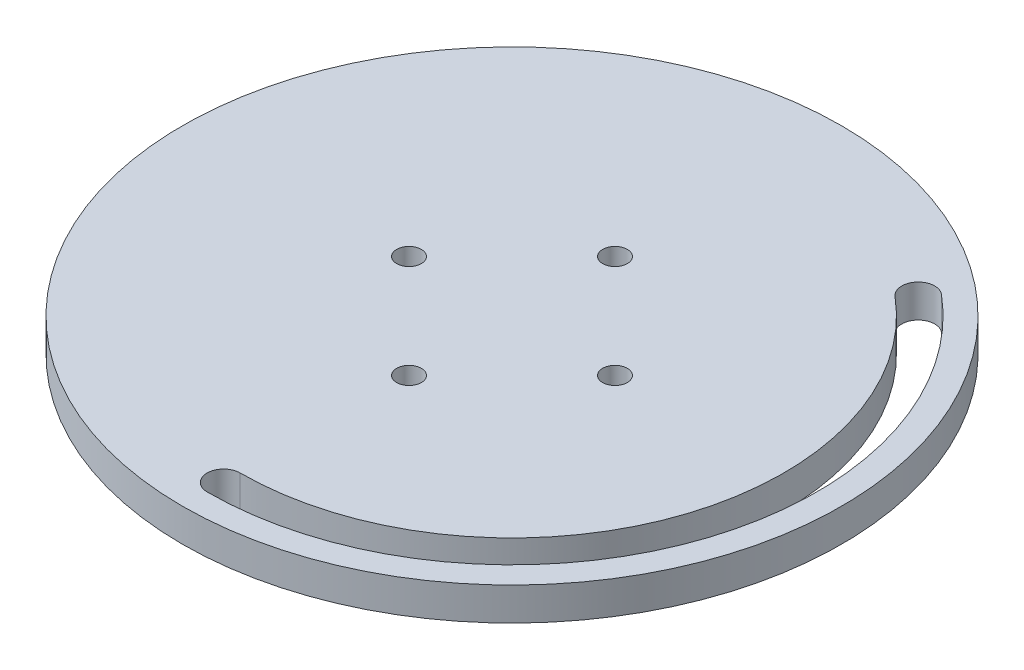
ISO-10303-21;
HEADER;
FILE_DESCRIPTION(('STEP AP214'),'2;1');
FILE_NAME('part.step','',(''),(''),'','','');
FILE_SCHEMA(('AUTOMOTIVE_DESIGN { 1 0 10303 214 1 1 1 1 }'));
ENDSEC;
DATA;
#1=APPLICATION_CONTEXT('core data for automotive mechanical design processes');
#2=APPLICATION_PROTOCOL_DEFINITION('international standard','automotive_design',2000,#1);
#3=PRODUCT_CONTEXT('',#1,'mechanical');
#4=PRODUCT('Part','Part','',(#3));
#5=PRODUCT_RELATED_PRODUCT_CATEGORY('part','',(#4));
#6=PRODUCT_DEFINITION_FORMATION('','',#4);
#7=PRODUCT_DEFINITION_CONTEXT('part definition',#1,'design');
#8=PRODUCT_DEFINITION('design','',#6,#7);
#9=PRODUCT_DEFINITION_SHAPE('','',#8);
#10=(LENGTH_UNIT() NAMED_UNIT(*) SI_UNIT(.MILLI.,.METRE.));
#11=(NAMED_UNIT(*) PLANE_ANGLE_UNIT() SI_UNIT($,.RADIAN.));
#12=(NAMED_UNIT(*) SI_UNIT($,.STERADIAN.) SOLID_ANGLE_UNIT());
#13=UNCERTAINTY_MEASURE_WITH_UNIT(LENGTH_MEASURE(1.E-05),#10,'distance_accuracy_value','');
#14=(GEOMETRIC_REPRESENTATION_CONTEXT(3) GLOBAL_UNCERTAINTY_ASSIGNED_CONTEXT((#13)) GLOBAL_UNIT_ASSIGNED_CONTEXT((#10,
#11,#12)) REPRESENTATION_CONTEXT('',''));
#15=CARTESIAN_POINT('',(0.,0.,0.));
#16=DIRECTION('',(0.,0.,1.));
#17=DIRECTION('',(1.,0.,0.));
#18=AXIS2_PLACEMENT_3D('',#15,#16,#17);
#19=CARTESIAN_POINT('',(0.,4.,0.));
#20=DIRECTION('',(0.,1.,0.));
#21=DIRECTION('',(0.,0.,1.));
#22=AXIS2_PLACEMENT_3D('',#19,#20,#21);
#23=PLANE('',#22);
#24=CARTESIAN_POINT('',(0.,4.,-12.5));
#25=DIRECTION('',(0.,1.,0.));
#26=DIRECTION('',(0.,0.,1.));
#27=AXIS2_PLACEMENT_3D('',#24,#25,#26);
#28=CIRCLE('',#27,1.5);
#29=CARTESIAN_POINT('',(0.,4.,-11.));
#30=VERTEX_POINT('',#29);
#31=EDGE_CURVE('E206',#30,#30,#28,.T.);
#32=ORIENTED_EDGE('',*,*,#31,.F.);
#33=EDGE_LOOP('',(#32));
#34=FACE_BOUND('',#33,.T.);
#35=CARTESIAN_POINT('',(0.,4.,12.5));
#36=DIRECTION('',(0.,1.,0.));
#37=DIRECTION('',(0.,0.,1.));
#38=AXIS2_PLACEMENT_3D('',#35,#36,#37);
#39=CIRCLE('',#38,1.5);
#40=CARTESIAN_POINT('',(0.,4.,14.));
#41=VERTEX_POINT('',#40);
#42=EDGE_CURVE('E102',#41,#41,#39,.T.);
#43=ORIENTED_EDGE('',*,*,#42,.F.);
#44=EDGE_LOOP('',(#43));
#45=FACE_BOUND('',#44,.T.);
#46=CARTESIAN_POINT('',(0.,4.,0.));
#47=DIRECTION('',(0.,1.,0.));
#48=DIRECTION('',(0.,0.,1.));
#49=AXIS2_PLACEMENT_3D('',#46,#47,#48);
#50=CIRCLE('',#49,40.);
#51=CARTESIAN_POINT('',(0.,4.,40.));
#52=VERTEX_POINT('',#51);
#53=EDGE_CURVE('E11',#52,#52,#50,.T.);
#54=ORIENTED_EDGE('',*,*,#53,.T.);
#55=EDGE_LOOP('',(#54));
#56=FACE_BOUND('',#55,.T.);
#57=CARTESIAN_POINT('',(0.,4.,35.));
#58=DIRECTION('',(0.,1.,0.));
#59=DIRECTION('',(0.,0.,1.));
#60=AXIS2_PLACEMENT_3D('',#57,#58,#59);
#61=CIRCLE('',#60,2.);
#62=CARTESIAN_POINT('',(0.,4.,33.));
#63=VERTEX_POINT('',#62);
#64=CARTESIAN_POINT('',(0.,4.,37.));
#65=VERTEX_POINT('',#64);
#66=EDGE_CURVE('E82',#63,#65,#61,.T.);
#67=ORIENTED_EDGE('',*,*,#66,.F.);
#68=CARTESIAN_POINT('',(0.,4.,0.));
#69=DIRECTION('',(0.,-1.,0.));
#70=DIRECTION('',(0.,0.,1.));
#71=AXIS2_PLACEMENT_3D('',#68,#69,#70);
#72=CIRCLE('',#71,33.);
#73=CARTESIAN_POINT('',(21.2119911196557,4.,-25.2794666229264));
#74=VERTEX_POINT('',#73);
#75=EDGE_CURVE('E74',#74,#63,#72,.T.);
#76=ORIENTED_EDGE('',*,*,#75,.F.);
#77=CARTESIAN_POINT('',(22.4975663390287,4.,-26.8115555091644));
#78=DIRECTION('',(0.,1.,0.));
#79=DIRECTION('',(0.,0.,1.));
#80=AXIS2_PLACEMENT_3D('',#77,#78,#79);
#81=CIRCLE('',#80,2.);
#82=CARTESIAN_POINT('',(23.7831415584018,4.,-28.3436443954023));
#83=VERTEX_POINT('',#82);
#84=EDGE_CURVE('E96',#83,#74,#81,.T.);
#85=ORIENTED_EDGE('',*,*,#84,.F.);
#86=CARTESIAN_POINT('',(0.,4.,0.));
#87=DIRECTION('',(0.,1.,0.));
#88=DIRECTION('',(0.,0.,-1.));
#89=AXIS2_PLACEMENT_3D('',#86,#87,#88);
#90=CIRCLE('',#89,37.);
#91=EDGE_CURVE('E94',#65,#83,#90,.T.);
#92=ORIENTED_EDGE('',*,*,#91,.F.);
#93=EDGE_LOOP('',(#67,#76,#85,#92));
#94=FACE_BOUND('',#93,.T.);
#95=CARTESIAN_POINT('',(-12.5,4.,0.));
#96=DIRECTION('',(0.,1.,0.));
#97=DIRECTION('',(0.,0.,1.));
#98=AXIS2_PLACEMENT_3D('',#95,#96,#97);
#99=CIRCLE('',#98,1.5);
#100=CARTESIAN_POINT('',(-12.5,4.,1.5));
#101=VERTEX_POINT('',#100);
#102=EDGE_CURVE('E212',#101,#101,#99,.T.);
#103=ORIENTED_EDGE('',*,*,#102,.F.);
#104=EDGE_LOOP('',(#103));
#105=FACE_BOUND('',#104,.T.);
#106=CARTESIAN_POINT('',(12.5,4.,0.));
#107=DIRECTION('',(0.,1.,0.));
#108=DIRECTION('',(0.,0.,1.));
#109=AXIS2_PLACEMENT_3D('',#106,#107,#108);
#110=CIRCLE('',#109,1.5);
#111=CARTESIAN_POINT('',(12.5,4.,1.5));
#112=VERTEX_POINT('',#111);
#113=EDGE_CURVE('E197',#112,#112,#110,.T.);
#114=ORIENTED_EDGE('',*,*,#113,.F.);
#115=EDGE_LOOP('',(#114));
#116=FACE_BOUND('',#115,.T.);
#117=ADVANCED_FACE('F33',(#34,#45,#56,#94,#105,#116),#23,.T.);
#118=CARTESIAN_POINT('',(0.,0.,0.));
#119=DIRECTION('',(0.,1.,0.));
#120=DIRECTION('',(0.,0.,1.));
#121=AXIS2_PLACEMENT_3D('',#118,#119,#120);
#122=PLANE('',#121);
#123=CARTESIAN_POINT('',(0.,0.,0.));
#124=DIRECTION('',(0.,1.,0.));
#125=DIRECTION('',(0.,0.,1.));
#126=AXIS2_PLACEMENT_3D('',#123,#124,#125);
#127=CIRCLE('',#126,40.);
#128=CARTESIAN_POINT('',(0.,0.,40.));
#129=VERTEX_POINT('',#128);
#130=EDGE_CURVE('E37',#129,#129,#127,.T.);
#131=ORIENTED_EDGE('',*,*,#130,.F.);
#132=EDGE_LOOP('',(#131));
#133=FACE_BOUND('',#132,.T.);
#134=CARTESIAN_POINT('',(0.,0.,0.));
#135=DIRECTION('',(0.,-1.,0.));
#136=DIRECTION('',(0.,0.,1.));
#137=AXIS2_PLACEMENT_3D('',#134,#135,#136);
#138=CIRCLE('',#137,33.);
#139=CARTESIAN_POINT('',(21.2119911196557,0.,-25.2794666229264));
#140=VERTEX_POINT('',#139);
#141=CARTESIAN_POINT('',(0.,0.,33.));
#142=VERTEX_POINT('',#141);
#143=EDGE_CURVE('E56',#140,#142,#138,.T.);
#144=ORIENTED_EDGE('',*,*,#143,.T.);
#145=CARTESIAN_POINT('',(0.,0.,35.));
#146=DIRECTION('',(0.,1.,0.));
#147=DIRECTION('',(0.,0.,1.));
#148=AXIS2_PLACEMENT_3D('',#145,#146,#147);
#149=CIRCLE('',#148,2.);
#150=CARTESIAN_POINT('',(0.,0.,37.));
#151=VERTEX_POINT('',#150);
#152=EDGE_CURVE('E89',#142,#151,#149,.T.);
#153=ORIENTED_EDGE('',*,*,#152,.T.);
#154=CARTESIAN_POINT('',(0.,0.,0.));
#155=DIRECTION('',(0.,1.,0.));
#156=DIRECTION('',(0.,0.,-1.));
#157=AXIS2_PLACEMENT_3D('',#154,#155,#156);
#158=CIRCLE('',#157,37.);
#159=CARTESIAN_POINT('',(23.7831415584018,0.,-28.3436443954023));
#160=VERTEX_POINT('',#159);
#161=EDGE_CURVE('E104',#151,#160,#158,.T.);
#162=ORIENTED_EDGE('',*,*,#161,.T.);
#163=CARTESIAN_POINT('',(22.4975663390287,0.,-26.8115555091644));
#164=DIRECTION('',(0.,1.,0.));
#165=DIRECTION('',(0.,0.,1.));
#166=AXIS2_PLACEMENT_3D('',#163,#164,#165);
#167=CIRCLE('',#166,2.);
#168=EDGE_CURVE('E83',#160,#140,#167,.T.);
#169=ORIENTED_EDGE('',*,*,#168,.T.);
#170=EDGE_LOOP('',(#144,#153,#162,#169));
#171=FACE_BOUND('',#170,.T.);
#172=CARTESIAN_POINT('',(0.,0.,12.5));
#173=DIRECTION('',(0.,1.,0.));
#174=DIRECTION('',(0.,0.,1.));
#175=AXIS2_PLACEMENT_3D('',#172,#173,#174);
#176=CIRCLE('',#175,1.5);
#177=CARTESIAN_POINT('',(0.,0.,14.));
#178=VERTEX_POINT('',#177);
#179=EDGE_CURVE('E215',#178,#178,#176,.T.);
#180=ORIENTED_EDGE('',*,*,#179,.T.);
#181=EDGE_LOOP('',(#180));
#182=FACE_BOUND('',#181,.T.);
#183=CARTESIAN_POINT('',(-12.5,0.,0.));
#184=DIRECTION('',(0.,1.,0.));
#185=DIRECTION('',(0.,0.,1.));
#186=AXIS2_PLACEMENT_3D('',#183,#184,#185);
#187=CIRCLE('',#186,1.5);
#188=CARTESIAN_POINT('',(-12.5,0.,1.5));
#189=VERTEX_POINT('',#188);
#190=EDGE_CURVE('E209',#189,#189,#187,.T.);
#191=ORIENTED_EDGE('',*,*,#190,.T.);
#192=EDGE_LOOP('',(#191));
#193=FACE_BOUND('',#192,.T.);
#194=CARTESIAN_POINT('',(0.,0.,-12.5));
#195=DIRECTION('',(0.,1.,0.));
#196=DIRECTION('',(0.,0.,1.));
#197=AXIS2_PLACEMENT_3D('',#194,#195,#196);
#198=CIRCLE('',#197,1.5);
#199=CARTESIAN_POINT('',(0.,0.,-11.));
#200=VERTEX_POINT('',#199);
#201=EDGE_CURVE('E203',#200,#200,#198,.T.);
#202=ORIENTED_EDGE('',*,*,#201,.T.);
#203=EDGE_LOOP('',(#202));
#204=FACE_BOUND('',#203,.T.);
#205=CARTESIAN_POINT('',(12.5,0.,0.));
#206=DIRECTION('',(0.,1.,0.));
#207=DIRECTION('',(0.,0.,1.));
#208=AXIS2_PLACEMENT_3D('',#205,#206,#207);
#209=CIRCLE('',#208,1.5);
#210=CARTESIAN_POINT('',(12.5,0.,1.5));
#211=VERTEX_POINT('',#210);
#212=EDGE_CURVE('E200',#211,#211,#209,.T.);
#213=ORIENTED_EDGE('',*,*,#212,.T.);
#214=EDGE_LOOP('',(#213));
#215=FACE_BOUND('',#214,.T.);
#216=ADVANCED_FACE('F115',(#133,#171,#182,#193,#204,#215),#122,.F.);
#217=CARTESIAN_POINT('',(0.,4.,0.));
#218=DIRECTION('',(0.,-1.,0.));
#219=DIRECTION('',(0.,0.,-1.));
#220=AXIS2_PLACEMENT_3D('',#217,#218,#219);
#221=CYLINDRICAL_SURFACE('',#220,40.);
#222=ORIENTED_EDGE('',*,*,#53,.F.);
#223=EDGE_LOOP('',(#222));
#224=FACE_BOUND('',#223,.T.);
#225=ORIENTED_EDGE('',*,*,#130,.T.);
#226=EDGE_LOOP('',(#225));
#227=FACE_BOUND('',#226,.T.);
#228=ADVANCED_FACE('F35',(#224,#227),#221,.T.);
#229=CARTESIAN_POINT('',(0.,4.,0.));
#230=DIRECTION('',(0.,-1.,0.));
#231=DIRECTION('',(0.,0.,-1.));
#232=AXIS2_PLACEMENT_3D('',#229,#230,#231);
#233=CYLINDRICAL_SURFACE('',#232,33.);
#234=ORIENTED_EDGE('',*,*,#143,.F.);
#235=DIRECTION('',(0.,-1.,0.));
#236=VECTOR('',#235,1.);
#237=CARTESIAN_POINT('',(21.2119911196557,4.,-25.2794666229264));
#238=LINE('',#237,#236);
#239=EDGE_CURVE('E78',#74,#140,#238,.T.);
#240=ORIENTED_EDGE('',*,*,#239,.F.);
#241=ORIENTED_EDGE('',*,*,#75,.T.);
#242=DIRECTION('',(0.,-1.,0.));
#243=VECTOR('',#242,1.);
#244=CARTESIAN_POINT('',(0.,4.,33.));
#245=LINE('',#244,#243);
#246=EDGE_CURVE('E77',#63,#142,#245,.T.);
#247=ORIENTED_EDGE('',*,*,#246,.T.);
#248=EDGE_LOOP('',(#234,#240,#241,#247));
#249=FACE_BOUND('',#248,.T.);
#250=ADVANCED_FACE('F76',(#249),#233,.T.);
#251=CARTESIAN_POINT('',(0.,4.,35.));
#252=DIRECTION('',(0.,-1.,0.));
#253=DIRECTION('',(0.,0.,-1.));
#254=AXIS2_PLACEMENT_3D('',#251,#252,#253);
#255=CYLINDRICAL_SURFACE('',#254,2.);
#256=ORIENTED_EDGE('',*,*,#152,.F.);
#257=ORIENTED_EDGE('',*,*,#246,.F.);
#258=ORIENTED_EDGE('',*,*,#66,.T.);
#259=DIRECTION('',(0.,-1.,0.));
#260=VECTOR('',#259,1.);
#261=CARTESIAN_POINT('',(0.,4.,37.));
#262=LINE('',#261,#260);
#263=EDGE_CURVE('E90',#65,#151,#262,.T.);
#264=ORIENTED_EDGE('',*,*,#263,.T.);
#265=EDGE_LOOP('',(#256,#257,#258,#264));
#266=FACE_BOUND('',#265,.T.);
#267=ADVANCED_FACE('F86',(#266),#255,.F.);
#268=CARTESIAN_POINT('',(0.,4.,0.));
#269=DIRECTION('',(0.,-1.,0.));
#270=DIRECTION('',(0.,0.,-1.));
#271=AXIS2_PLACEMENT_3D('',#268,#269,#270);
#272=CYLINDRICAL_SURFACE('',#271,37.);
#273=ORIENTED_EDGE('',*,*,#161,.F.);
#274=ORIENTED_EDGE('',*,*,#263,.F.);
#275=ORIENTED_EDGE('',*,*,#91,.T.);
#276=DIRECTION('',(0.,-1.,0.));
#277=VECTOR('',#276,1.);
#278=CARTESIAN_POINT('',(23.7831415584018,4.,-28.3436443954023));
#279=LINE('',#278,#277);
#280=EDGE_CURVE('E48',#83,#160,#279,.T.);
#281=ORIENTED_EDGE('',*,*,#280,.T.);
#282=EDGE_LOOP('',(#273,#274,#275,#281));
#283=FACE_BOUND('',#282,.T.);
#284=ADVANCED_FACE('F113',(#283),#272,.F.);
#285=CARTESIAN_POINT('',(22.4975663390287,4.,-26.8115555091644));
#286=DIRECTION('',(0.,-1.,0.));
#287=DIRECTION('',(0.,0.,-1.));
#288=AXIS2_PLACEMENT_3D('',#285,#286,#287);
#289=CYLINDRICAL_SURFACE('',#288,2.);
#290=ORIENTED_EDGE('',*,*,#168,.F.);
#291=ORIENTED_EDGE('',*,*,#280,.F.);
#292=ORIENTED_EDGE('',*,*,#84,.T.);
#293=ORIENTED_EDGE('',*,*,#239,.T.);
#294=EDGE_LOOP('',(#290,#291,#292,#293));
#295=FACE_BOUND('',#294,.T.);
#296=ADVANCED_FACE('F117',(#295),#289,.F.);
#297=CARTESIAN_POINT('',(0.,4.,12.5));
#298=DIRECTION('',(0.,-1.,0.));
#299=DIRECTION('',(0.,0.,-1.));
#300=AXIS2_PLACEMENT_3D('',#297,#298,#299);
#301=CYLINDRICAL_SURFACE('',#300,1.5);
#302=ORIENTED_EDGE('',*,*,#42,.T.);
#303=EDGE_LOOP('',(#302));
#304=FACE_BOUND('',#303,.T.);
#305=ORIENTED_EDGE('',*,*,#179,.F.);
#306=EDGE_LOOP('',(#305));
#307=FACE_BOUND('',#306,.T.);
#308=ADVANCED_FACE('F119',(#304,#307),#301,.F.);
#309=CARTESIAN_POINT('',(-12.5,4.,0.));
#310=DIRECTION('',(0.,-1.,0.));
#311=DIRECTION('',(0.,0.,-1.));
#312=AXIS2_PLACEMENT_3D('',#309,#310,#311);
#313=CYLINDRICAL_SURFACE('',#312,1.5);
#314=ORIENTED_EDGE('',*,*,#102,.T.);
#315=EDGE_LOOP('',(#314));
#316=FACE_BOUND('',#315,.T.);
#317=ORIENTED_EDGE('',*,*,#190,.F.);
#318=EDGE_LOOP('',(#317));
#319=FACE_BOUND('',#318,.T.);
#320=ADVANCED_FACE('F125',(#316,#319),#313,.F.);
#321=CARTESIAN_POINT('',(0.,4.,-12.5));
#322=DIRECTION('',(0.,-1.,0.));
#323=DIRECTION('',(0.,0.,-1.));
#324=AXIS2_PLACEMENT_3D('',#321,#322,#323);
#325=CYLINDRICAL_SURFACE('',#324,1.5);
#326=ORIENTED_EDGE('',*,*,#31,.T.);
#327=EDGE_LOOP('',(#326));
#328=FACE_BOUND('',#327,.T.);
#329=ORIENTED_EDGE('',*,*,#201,.F.);
#330=EDGE_LOOP('',(#329));
#331=FACE_BOUND('',#330,.T.);
#332=ADVANCED_FACE('F170',(#328,#331),#325,.F.);
#333=CARTESIAN_POINT('',(12.5,4.,0.));
#334=DIRECTION('',(0.,-1.,0.));
#335=DIRECTION('',(0.,0.,-1.));
#336=AXIS2_PLACEMENT_3D('',#333,#334,#335);
#337=CYLINDRICAL_SURFACE('',#336,1.5);
#338=ORIENTED_EDGE('',*,*,#113,.T.);
#339=EDGE_LOOP('',(#338));
#340=FACE_BOUND('',#339,.T.);
#341=ORIENTED_EDGE('',*,*,#212,.F.);
#342=EDGE_LOOP('',(#341));
#343=FACE_BOUND('',#342,.T.);
#344=ADVANCED_FACE('F180',(#340,#343),#337,.F.);
#345=CLOSED_SHELL('',(#117,#216,#228,#250,#267,#284,#296,#308,#320,#332,#344));
#346=MANIFOLD_SOLID_BREP('B2',#345);
#347=ADVANCED_BREP_SHAPE_REPRESENTATION('',(#18,#346),#14);
#348=SHAPE_DEFINITION_REPRESENTATION(#9,#347);
ENDSEC;
END-ISO-10303-21;
